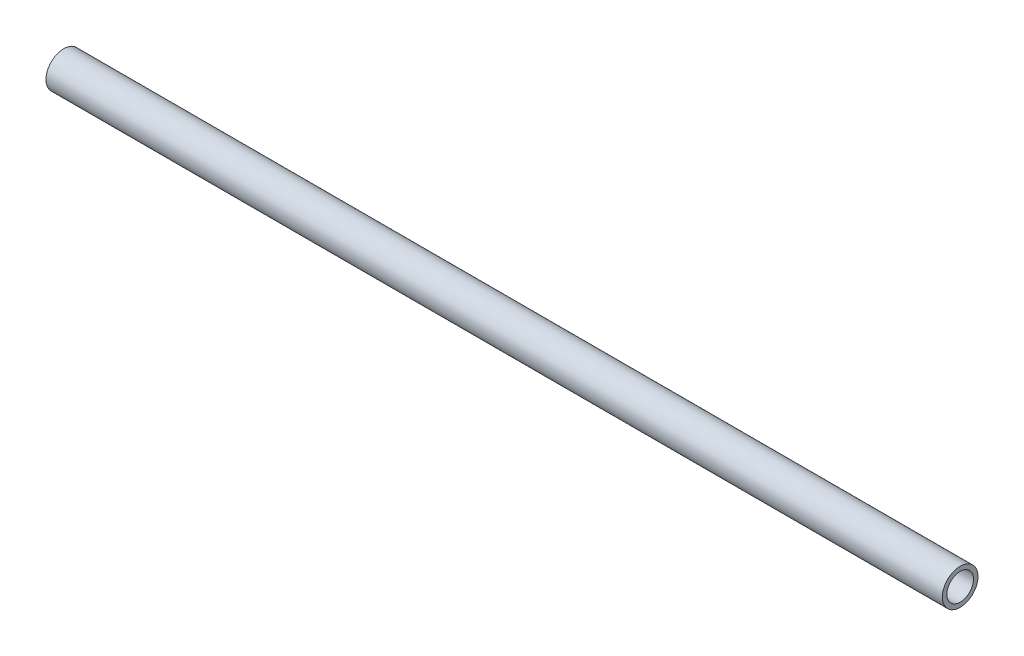
ISO-10303-21;
HEADER;
FILE_DESCRIPTION(('STEP AP214'),'2;1');
FILE_NAME('part.step','',(''),(''),'','','');
FILE_SCHEMA(('AUTOMOTIVE_DESIGN { 1 0 10303 214 1 1 1 1 }'));
ENDSEC;
DATA;
#1=APPLICATION_CONTEXT('core data for automotive mechanical design processes');
#2=APPLICATION_PROTOCOL_DEFINITION('international standard','automotive_design',2000,#1);
#3=PRODUCT_CONTEXT('',#1,'mechanical');
#4=PRODUCT('Part','Part','',(#3));
#5=PRODUCT_RELATED_PRODUCT_CATEGORY('part','',(#4));
#6=PRODUCT_DEFINITION_FORMATION('','',#4);
#7=PRODUCT_DEFINITION_CONTEXT('part definition',#1,'design');
#8=PRODUCT_DEFINITION('design','',#6,#7);
#9=PRODUCT_DEFINITION_SHAPE('','',#8);
#10=(LENGTH_UNIT() NAMED_UNIT(*) SI_UNIT(.MILLI.,.METRE.));
#11=(NAMED_UNIT(*) PLANE_ANGLE_UNIT() SI_UNIT($,.RADIAN.));
#12=(NAMED_UNIT(*) SI_UNIT($,.STERADIAN.) SOLID_ANGLE_UNIT());
#13=UNCERTAINTY_MEASURE_WITH_UNIT(LENGTH_MEASURE(1.E-05),#10,'distance_accuracy_value','');
#14=(GEOMETRIC_REPRESENTATION_CONTEXT(3) GLOBAL_UNCERTAINTY_ASSIGNED_CONTEXT((#13)) GLOBAL_UNIT_ASSIGNED_CONTEXT((#10,
#11,#12)) REPRESENTATION_CONTEXT('',''));
#15=CARTESIAN_POINT('',(0.,0.,0.));
#16=DIRECTION('',(0.,0.,1.));
#17=DIRECTION('',(1.,0.,0.));
#18=AXIS2_PLACEMENT_3D('',#15,#16,#17);
#19=CARTESIAN_POINT('',(0.,0.,0.));
#20=DIRECTION('',(1.,0.,0.));
#21=DIRECTION('',(0.,0.,-1.));
#22=AXIS2_PLACEMENT_3D('',#19,#20,#21);
#23=CYLINDRICAL_SURFACE('',#22,8.1153);
#24=CARTESIAN_POINT('',(546.1,0.,0.));
#25=DIRECTION('',(1.,0.,0.));
#26=DIRECTION('',(0.,0.,-1.));
#27=AXIS2_PLACEMENT_3D('',#24,#25,#26);
#28=CIRCLE('',#27,8.1153);
#29=CARTESIAN_POINT('',(546.1,0.,-8.1153));
#30=VERTEX_POINT('',#29);
#31=EDGE_CURVE('E17',#30,#30,#28,.F.);
#32=ORIENTED_EDGE('',*,*,#31,.F.);
#33=EDGE_LOOP('',(#32));
#34=FACE_BOUND('',#33,.T.);
#35=CARTESIAN_POINT('',(0.,0.,0.));
#36=DIRECTION('',(1.,0.,0.));
#37=DIRECTION('',(0.,0.,-1.));
#38=AXIS2_PLACEMENT_3D('',#35,#36,#37);
#39=CIRCLE('',#38,8.1153);
#40=CARTESIAN_POINT('',(0.,0.,-8.1153));
#41=VERTEX_POINT('',#40);
#42=EDGE_CURVE('E26',#41,#41,#39,.F.);
#43=ORIENTED_EDGE('',*,*,#42,.T.);
#44=EDGE_LOOP('',(#43));
#45=FACE_BOUND('',#44,.T.);
#46=ADVANCED_FACE('F14',(#34,#45),#23,.F.);
#47=CARTESIAN_POINT('',(546.1,0.,0.));
#48=DIRECTION('',(1.,0.,0.));
#49=DIRECTION('',(0.,0.,-1.));
#50=AXIS2_PLACEMENT_3D('',#47,#48,#49);
#51=PLANE('',#50);
#52=ORIENTED_EDGE('',*,*,#31,.T.);
#53=EDGE_LOOP('',(#52));
#54=FACE_BOUND('',#53,.T.);
#55=CARTESIAN_POINT('',(546.1,0.,0.));
#56=DIRECTION('',(1.,0.,0.));
#57=DIRECTION('',(0.,0.,-1.));
#58=AXIS2_PLACEMENT_3D('',#55,#56,#57);
#59=CIRCLE('',#58,10.8585);
#60=CARTESIAN_POINT('',(546.1,0.,-10.8585));
#61=VERTEX_POINT('',#60);
#62=EDGE_CURVE('E21',#61,#61,#59,.F.);
#63=ORIENTED_EDGE('',*,*,#62,.F.);
#64=EDGE_LOOP('',(#63));
#65=FACE_BOUND('',#64,.T.);
#66=ADVANCED_FACE('F34',(#54,#65),#51,.T.);
#67=CARTESIAN_POINT('',(0.,0.,0.));
#68=DIRECTION('',(1.,0.,0.));
#69=DIRECTION('',(0.,0.,-1.));
#70=AXIS2_PLACEMENT_3D('',#67,#68,#69);
#71=PLANE('',#70);
#72=ORIENTED_EDGE('',*,*,#42,.F.);
#73=EDGE_LOOP('',(#72));
#74=FACE_BOUND('',#73,.T.);
#75=CARTESIAN_POINT('',(0.,0.,0.));
#76=DIRECTION('',(1.,0.,0.));
#77=DIRECTION('',(0.,0.,-1.));
#78=AXIS2_PLACEMENT_3D('',#75,#76,#77);
#79=CIRCLE('',#78,10.8585);
#80=CARTESIAN_POINT('',(0.,0.,-10.8585));
#81=VERTEX_POINT('',#80);
#82=EDGE_CURVE('E10',#81,#81,#79,.T.);
#83=ORIENTED_EDGE('',*,*,#82,.F.);
#84=EDGE_LOOP('',(#83));
#85=FACE_BOUND('',#84,.T.);
#86=ADVANCED_FACE('F42',(#74,#85),#71,.F.);
#87=CARTESIAN_POINT('',(0.,0.,0.));
#88=DIRECTION('',(1.,0.,0.));
#89=DIRECTION('',(0.,0.,-1.));
#90=AXIS2_PLACEMENT_3D('',#87,#88,#89);
#91=CYLINDRICAL_SURFACE('',#90,10.8585);
#92=ORIENTED_EDGE('',*,*,#62,.T.);
#93=EDGE_LOOP('',(#92));
#94=FACE_BOUND('',#93,.T.);
#95=ORIENTED_EDGE('',*,*,#82,.T.);
#96=EDGE_LOOP('',(#95));
#97=FACE_BOUND('',#96,.T.);
#98=ADVANCED_FACE('F43',(#94,#97),#91,.T.);
#99=CLOSED_SHELL('',(#46,#66,#86,#98));
#100=MANIFOLD_SOLID_BREP('B1',#99);
#101=ADVANCED_BREP_SHAPE_REPRESENTATION('',(#18,#100),#14);
#102=SHAPE_DEFINITION_REPRESENTATION(#9,#101);
ENDSEC;
END-ISO-10303-21;
